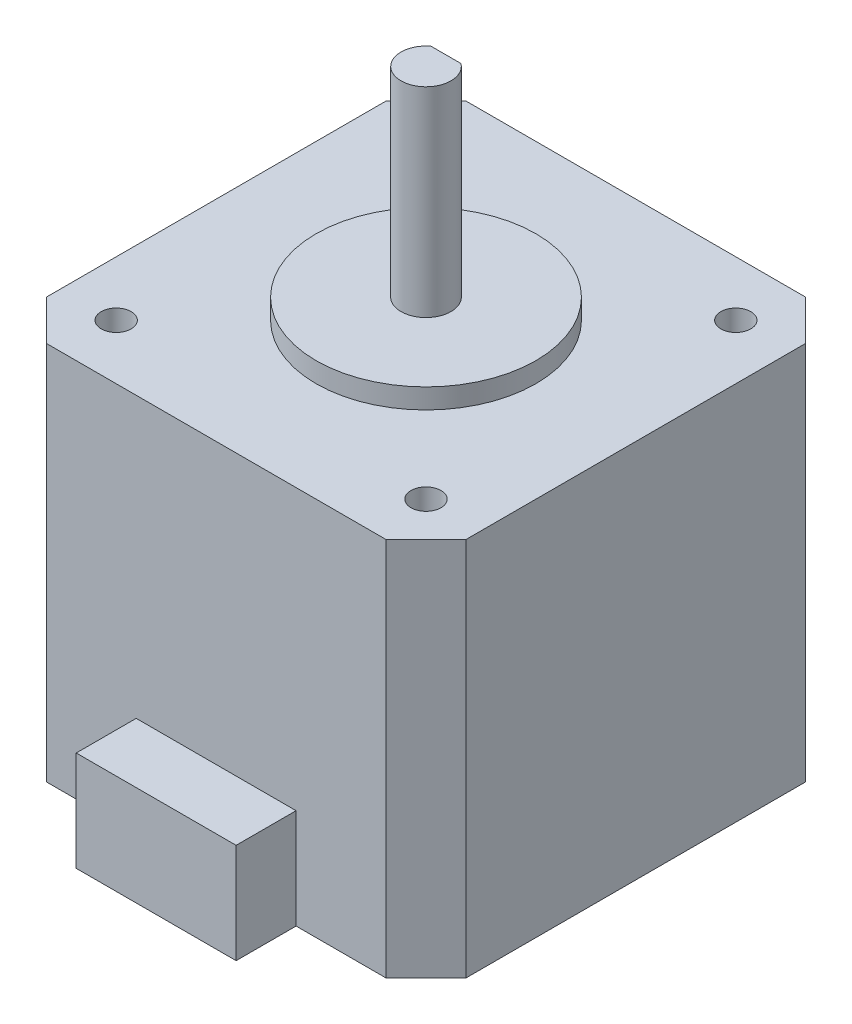
ISO-10303-21;
HEADER;
FILE_DESCRIPTION(('STEP AP214'),'2;1');
FILE_NAME('part.step','',(''),(''),'','','');
FILE_SCHEMA(('AUTOMOTIVE_DESIGN { 1 0 10303 214 1 1 1 1 }'));
ENDSEC;
DATA;
#1=APPLICATION_CONTEXT('core data for automotive mechanical design processes');
#2=APPLICATION_PROTOCOL_DEFINITION('international standard','automotive_design',2000,#1);
#3=PRODUCT_CONTEXT('',#1,'mechanical');
#4=PRODUCT('Part','Part','',(#3));
#5=PRODUCT_RELATED_PRODUCT_CATEGORY('part','',(#4));
#6=PRODUCT_DEFINITION_FORMATION('','',#4);
#7=PRODUCT_DEFINITION_CONTEXT('part definition',#1,'design');
#8=PRODUCT_DEFINITION('design','',#6,#7);
#9=PRODUCT_DEFINITION_SHAPE('','',#8);
#10=(LENGTH_UNIT() NAMED_UNIT(*) SI_UNIT(.MILLI.,.METRE.));
#11=(NAMED_UNIT(*) PLANE_ANGLE_UNIT() SI_UNIT($,.RADIAN.));
#12=(NAMED_UNIT(*) SI_UNIT($,.STERADIAN.) SOLID_ANGLE_UNIT());
#13=UNCERTAINTY_MEASURE_WITH_UNIT(LENGTH_MEASURE(1.E-05),#10,'distance_accuracy_value','');
#14=(GEOMETRIC_REPRESENTATION_CONTEXT(3) GLOBAL_UNCERTAINTY_ASSIGNED_CONTEXT((#13)) GLOBAL_UNIT_ASSIGNED_CONTEXT((#10,
#11,#12)) REPRESENTATION_CONTEXT('',''));
#15=CARTESIAN_POINT('',(0.,0.,0.));
#16=DIRECTION('',(0.,0.,1.));
#17=DIRECTION('',(1.,0.,0.));
#18=AXIS2_PLACEMENT_3D('',#15,#16,#17);
#19=CARTESIAN_POINT('',(-21.,38.,21.));
#20=DIRECTION('',(0.,0.,-1.));
#21=DIRECTION('',(-1.,0.,0.));
#22=AXIS2_PLACEMENT_3D('',#19,#20,#21);
#23=PLANE('',#22);
#24=DIRECTION('',(1.,0.,0.));
#25=VECTOR('',#24,1.);
#26=CARTESIAN_POINT('',(-21.,38.,21.));
#27=LINE('',#26,#25);
#28=CARTESIAN_POINT('',(-17.,38.,21.));
#29=VERTEX_POINT('',#28);
#30=CARTESIAN_POINT('',(17.,38.,21.));
#31=VERTEX_POINT('',#30);
#32=EDGE_CURVE('E221',#29,#31,#27,.T.);
#33=ORIENTED_EDGE('',*,*,#32,.F.);
#34=DIRECTION('',(0.,-1.,0.));
#35=VECTOR('',#34,1.);
#36=CARTESIAN_POINT('',(-17.,38.,21.));
#37=LINE('',#36,#35);
#38=CARTESIAN_POINT('',(-17.,0.,21.));
#39=VERTEX_POINT('',#38);
#40=EDGE_CURVE('E241',#29,#39,#37,.T.);
#41=ORIENTED_EDGE('',*,*,#40,.T.);
#42=DIRECTION('',(1.,0.,0.));
#43=VECTOR('',#42,1.);
#44=CARTESIAN_POINT('',(-21.,0.,21.));
#45=LINE('',#44,#43);
#46=CARTESIAN_POINT('',(-8.,0.,21.));
#47=VERTEX_POINT('',#46);
#48=EDGE_CURVE('E162',#39,#47,#45,.T.);
#49=ORIENTED_EDGE('',*,*,#48,.T.);
#50=DIRECTION('',(0.,-1.,0.));
#51=VECTOR('',#50,1.);
#52=CARTESIAN_POINT('',(-8.,10.,21.));
#53=LINE('',#52,#51);
#54=CARTESIAN_POINT('',(-8.,10.,21.));
#55=VERTEX_POINT('',#54);
#56=EDGE_CURVE('E154',#55,#47,#53,.T.);
#57=ORIENTED_EDGE('',*,*,#56,.F.);
#58=DIRECTION('',(1.,0.,0.));
#59=VECTOR('',#58,1.);
#60=CARTESIAN_POINT('',(-8.,10.,21.));
#61=LINE('',#60,#59);
#62=CARTESIAN_POINT('',(8.,10.,21.));
#63=VERTEX_POINT('',#62);
#64=EDGE_CURVE('E138',#55,#63,#61,.T.);
#65=ORIENTED_EDGE('',*,*,#64,.T.);
#66=DIRECTION('',(0.,-1.,0.));
#67=VECTOR('',#66,1.);
#68=CARTESIAN_POINT('',(8.,10.,21.));
#69=LINE('',#68,#67);
#70=CARTESIAN_POINT('',(7.99999999999999,0.,21.));
#71=VERTEX_POINT('',#70);
#72=EDGE_CURVE('E163',#63,#71,#69,.T.);
#73=ORIENTED_EDGE('',*,*,#72,.T.);
#74=CARTESIAN_POINT('',(17.,0.,21.));
#75=VERTEX_POINT('',#74);
#76=EDGE_CURVE('E238',#71,#75,#45,.T.);
#77=ORIENTED_EDGE('',*,*,#76,.T.);
#78=DIRECTION('',(0.,1.,0.));
#79=VECTOR('',#78,1.);
#80=CARTESIAN_POINT('',(17.,38.,21.));
#81=LINE('',#80,#79);
#82=EDGE_CURVE('E214',#75,#31,#81,.T.);
#83=ORIENTED_EDGE('',*,*,#82,.T.);
#84=EDGE_LOOP('',(#33,#41,#49,#57,#65,#73,#77,#83));
#85=FACE_BOUND('',#84,.T.);
#86=ADVANCED_FACE('F34',(#85),#23,.F.);
#87=CARTESIAN_POINT('',(21.,38.,21.));
#88=DIRECTION('',(-1.,0.,0.));
#89=DIRECTION('',(0.,0.,1.));
#90=AXIS2_PLACEMENT_3D('',#87,#88,#89);
#91=PLANE('',#90);
#92=DIRECTION('',(0.,0.,-1.));
#93=VECTOR('',#92,1.);
#94=CARTESIAN_POINT('',(21.,0.,21.));
#95=LINE('',#94,#93);
#96=CARTESIAN_POINT('',(21.,0.,17.));
#97=VERTEX_POINT('',#96);
#98=CARTESIAN_POINT('',(21.,0.,-17.));
#99=VERTEX_POINT('',#98);
#100=EDGE_CURVE('E218',#97,#99,#95,.T.);
#101=ORIENTED_EDGE('',*,*,#100,.T.);
#102=DIRECTION('',(0.,1.,0.));
#103=VECTOR('',#102,1.);
#104=CARTESIAN_POINT('',(21.,38.,-17.));
#105=LINE('',#104,#103);
#106=CARTESIAN_POINT('',(21.,38.,-17.));
#107=VERTEX_POINT('',#106);
#108=EDGE_CURVE('E11',#99,#107,#105,.T.);
#109=ORIENTED_EDGE('',*,*,#108,.T.);
#110=DIRECTION('',(0.,0.,-1.));
#111=VECTOR('',#110,1.);
#112=CARTESIAN_POINT('',(21.,38.,21.));
#113=LINE('',#112,#111);
#114=CARTESIAN_POINT('',(21.,38.,17.));
#115=VERTEX_POINT('',#114);
#116=EDGE_CURVE('E222',#115,#107,#113,.T.);
#117=ORIENTED_EDGE('',*,*,#116,.F.);
#118=DIRECTION('',(0.,-1.,0.));
#119=VECTOR('',#118,1.);
#120=CARTESIAN_POINT('',(21.,38.,17.));
#121=LINE('',#120,#119);
#122=EDGE_CURVE('E43',#115,#97,#121,.T.);
#123=ORIENTED_EDGE('',*,*,#122,.T.);
#124=EDGE_LOOP('',(#101,#109,#117,#123));
#125=FACE_BOUND('',#124,.T.);
#126=ADVANCED_FACE('F271',(#125),#91,.F.);
#127=CARTESIAN_POINT('',(-21.,38.,-21.));
#128=DIRECTION('',(0.,0.,1.));
#129=DIRECTION('',(1.,0.,0.));
#130=AXIS2_PLACEMENT_3D('',#127,#128,#129);
#131=PLANE('',#130);
#132=DIRECTION('',(-1.,0.,0.));
#133=VECTOR('',#132,1.);
#134=CARTESIAN_POINT('',(-21.,0.,-21.));
#135=LINE('',#134,#133);
#136=CARTESIAN_POINT('',(17.,0.,-21.));
#137=VERTEX_POINT('',#136);
#138=CARTESIAN_POINT('',(-17.,0.,-21.));
#139=VERTEX_POINT('',#138);
#140=EDGE_CURVE('E233',#137,#139,#135,.T.);
#141=ORIENTED_EDGE('',*,*,#140,.T.);
#142=DIRECTION('',(0.,1.,0.));
#143=VECTOR('',#142,1.);
#144=CARTESIAN_POINT('',(-17.,38.,-21.));
#145=LINE('',#144,#143);
#146=CARTESIAN_POINT('',(-17.,38.,-21.));
#147=VERTEX_POINT('',#146);
#148=EDGE_CURVE('E50',#139,#147,#145,.T.);
#149=ORIENTED_EDGE('',*,*,#148,.T.);
#150=DIRECTION('',(-1.,0.,0.));
#151=VECTOR('',#150,1.);
#152=CARTESIAN_POINT('',(-21.,38.,-21.));
#153=LINE('',#152,#151);
#154=CARTESIAN_POINT('',(17.,38.,-21.));
#155=VERTEX_POINT('',#154);
#156=EDGE_CURVE('E224',#155,#147,#153,.T.);
#157=ORIENTED_EDGE('',*,*,#156,.F.);
#158=DIRECTION('',(0.,-1.,0.));
#159=VECTOR('',#158,1.);
#160=CARTESIAN_POINT('',(17.,38.,-21.));
#161=LINE('',#160,#159);
#162=EDGE_CURVE('E263',#155,#137,#161,.T.);
#163=ORIENTED_EDGE('',*,*,#162,.T.);
#164=EDGE_LOOP('',(#141,#149,#157,#163));
#165=FACE_BOUND('',#164,.T.);
#166=ADVANCED_FACE('F283',(#165),#131,.F.);
#167=CARTESIAN_POINT('',(-21.,38.,21.));
#168=DIRECTION('',(1.,0.,0.));
#169=DIRECTION('',(0.,0.,-1.));
#170=AXIS2_PLACEMENT_3D('',#167,#168,#169);
#171=PLANE('',#170);
#172=DIRECTION('',(0.,0.,1.));
#173=VECTOR('',#172,1.);
#174=CARTESIAN_POINT('',(-21.,0.,21.));
#175=LINE('',#174,#173);
#176=CARTESIAN_POINT('',(-21.,0.,-17.));
#177=VERTEX_POINT('',#176);
#178=CARTESIAN_POINT('',(-21.,0.,17.));
#179=VERTEX_POINT('',#178);
#180=EDGE_CURVE('E235',#177,#179,#175,.T.);
#181=ORIENTED_EDGE('',*,*,#180,.T.);
#182=DIRECTION('',(0.,1.,0.));
#183=VECTOR('',#182,1.);
#184=CARTESIAN_POINT('',(-21.,38.,17.));
#185=LINE('',#184,#183);
#186=CARTESIAN_POINT('',(-21.,38.,17.));
#187=VERTEX_POINT('',#186);
#188=EDGE_CURVE('E254',#179,#187,#185,.T.);
#189=ORIENTED_EDGE('',*,*,#188,.T.);
#190=DIRECTION('',(0.,0.,1.));
#191=VECTOR('',#190,1.);
#192=CARTESIAN_POINT('',(-21.,38.,21.));
#193=LINE('',#192,#191);
#194=CARTESIAN_POINT('',(-21.,38.,-17.));
#195=VERTEX_POINT('',#194);
#196=EDGE_CURVE('E226',#195,#187,#193,.T.);
#197=ORIENTED_EDGE('',*,*,#196,.F.);
#198=DIRECTION('',(0.,-1.,0.));
#199=VECTOR('',#198,1.);
#200=CARTESIAN_POINT('',(-21.,38.,-17.));
#201=LINE('',#200,#199);
#202=EDGE_CURVE('E251',#195,#177,#201,.T.);
#203=ORIENTED_EDGE('',*,*,#202,.T.);
#204=EDGE_LOOP('',(#181,#189,#197,#203));
#205=FACE_BOUND('',#204,.T.);
#206=ADVANCED_FACE('F292',(#205),#171,.F.);
#207=CARTESIAN_POINT('',(0.,38.,0.));
#208=DIRECTION('',(0.,-1.,0.));
#209=DIRECTION('',(0.,0.,-1.));
#210=AXIS2_PLACEMENT_3D('',#207,#208,#209);
#211=PLANE('',#210);
#212=CARTESIAN_POINT('',(15.5,38.,15.5000000000001));
#213=DIRECTION('',(0.,1.,0.));
#214=DIRECTION('',(-1.,0.,0.));
#215=AXIS2_PLACEMENT_3D('',#212,#213,#214);
#216=CIRCLE('',#215,1.5);
#217=CARTESIAN_POINT('',(14.,38.,15.5));
#218=VERTEX_POINT('',#217);
#219=EDGE_CURVE('E175',#218,#218,#216,.T.);
#220=ORIENTED_EDGE('',*,*,#219,.F.);
#221=EDGE_LOOP('',(#220));
#222=FACE_BOUND('',#221,.T.);
#223=CARTESIAN_POINT('',(-15.5,38.,15.5000000000001));
#224=DIRECTION('',(0.,1.,0.));
#225=DIRECTION('',(0.,0.,-1.));
#226=AXIS2_PLACEMENT_3D('',#223,#224,#225);
#227=CIRCLE('',#226,1.5);
#228=CARTESIAN_POINT('',(-15.5,38.,14.0000000000001));
#229=VERTEX_POINT('',#228);
#230=EDGE_CURVE('E181',#229,#229,#227,.T.);
#231=ORIENTED_EDGE('',*,*,#230,.F.);
#232=EDGE_LOOP('',(#231));
#233=FACE_BOUND('',#232,.T.);
#234=CARTESIAN_POINT('',(-15.4999999999999,38.,-15.5000000000002));
#235=DIRECTION('',(0.,1.,0.));
#236=DIRECTION('',(1.,0.,0.));
#237=AXIS2_PLACEMENT_3D('',#234,#235,#236);
#238=CIRCLE('',#237,1.5);
#239=CARTESIAN_POINT('',(-13.9999999999999,38.,-15.5000000000001));
#240=VERTEX_POINT('',#239);
#241=EDGE_CURVE('E187',#240,#240,#238,.T.);
#242=ORIENTED_EDGE('',*,*,#241,.F.);
#243=EDGE_LOOP('',(#242));
#244=FACE_BOUND('',#243,.T.);
#245=CARTESIAN_POINT('',(15.5,38.,-15.5000000000001));
#246=DIRECTION('',(0.,1.,0.));
#247=DIRECTION('',(0.,0.,1.));
#248=AXIS2_PLACEMENT_3D('',#245,#246,#247);
#249=CIRCLE('',#248,1.5);
#250=CARTESIAN_POINT('',(15.5,38.,-14.0000000000001));
#251=VERTEX_POINT('',#250);
#252=EDGE_CURVE('E174',#251,#251,#249,.T.);
#253=ORIENTED_EDGE('',*,*,#252,.F.);
#254=EDGE_LOOP('',(#253));
#255=FACE_BOUND('',#254,.T.);
#256=CARTESIAN_POINT('',(0.,38.,0.));
#257=DIRECTION('',(0.,1.,0.));
#258=DIRECTION('',(0.,0.,1.));
#259=AXIS2_PLACEMENT_3D('',#256,#257,#258);
#260=CIRCLE('',#259,11.);
#261=CARTESIAN_POINT('',(0.,38.,11.));
#262=VERTEX_POINT('',#261);
#263=EDGE_CURVE('E215',#262,#262,#260,.T.);
#264=ORIENTED_EDGE('',*,*,#263,.F.);
#265=EDGE_LOOP('',(#264));
#266=FACE_BOUND('',#265,.T.);
#267=ORIENTED_EDGE('',*,*,#196,.T.);
#268=DIRECTION('',(-0.707106781186547,0.,-0.707106781186548));
#269=VECTOR('',#268,1.);
#270=CARTESIAN_POINT('',(-17.,38.,21.));
#271=LINE('',#270,#269);
#272=EDGE_CURVE('E261',#187,#29,#271,.F.);
#273=ORIENTED_EDGE('',*,*,#272,.T.);
#274=ORIENTED_EDGE('',*,*,#32,.T.);
#275=DIRECTION('',(-0.707106781186548,0.,0.707106781186547));
#276=VECTOR('',#275,1.);
#277=CARTESIAN_POINT('',(21.,38.,17.));
#278=LINE('',#277,#276);
#279=EDGE_CURVE('E256',#31,#115,#278,.F.);
#280=ORIENTED_EDGE('',*,*,#279,.T.);
#281=ORIENTED_EDGE('',*,*,#116,.T.);
#282=DIRECTION('',(0.707106781186547,0.,0.707106781186548));
#283=VECTOR('',#282,1.);
#284=CARTESIAN_POINT('',(17.,38.,-21.));
#285=LINE('',#284,#283);
#286=EDGE_CURVE('E57',#107,#155,#285,.F.);
#287=ORIENTED_EDGE('',*,*,#286,.T.);
#288=ORIENTED_EDGE('',*,*,#156,.T.);
#289=DIRECTION('',(0.707106781186548,0.,-0.707106781186547));
#290=VECTOR('',#289,1.);
#291=CARTESIAN_POINT('',(-21.,38.,-17.));
#292=LINE('',#291,#290);
#293=EDGE_CURVE('E259',#147,#195,#292,.F.);
#294=ORIENTED_EDGE('',*,*,#293,.T.);
#295=EDGE_LOOP('',(#267,#273,#274,#280,#281,#287,#288,#294));
#296=FACE_BOUND('',#295,.T.);
#297=ADVANCED_FACE('F285',(#222,#233,#244,#255,#266,#296),#211,.F.);
#298=CARTESIAN_POINT('',(0.,0.,0.));
#299=DIRECTION('',(0.,-1.,0.));
#300=DIRECTION('',(0.,0.,-1.));
#301=AXIS2_PLACEMENT_3D('',#298,#299,#300);
#302=PLANE('',#301);
#303=ORIENTED_EDGE('',*,*,#48,.F.);
#304=DIRECTION('',(0.707106781186547,0.,0.707106781186548));
#305=VECTOR('',#304,1.);
#306=CARTESIAN_POINT('',(-19.,0.,19.));
#307=LINE('',#306,#305);
#308=EDGE_CURVE('E249',#39,#179,#307,.F.);
#309=ORIENTED_EDGE('',*,*,#308,.T.);
#310=ORIENTED_EDGE('',*,*,#180,.F.);
#311=DIRECTION('',(-0.707106781186548,0.,0.707106781186547));
#312=VECTOR('',#311,1.);
#313=CARTESIAN_POINT('',(-19.,0.,-19.));
#314=LINE('',#313,#312);
#315=EDGE_CURVE('E247',#177,#139,#314,.F.);
#316=ORIENTED_EDGE('',*,*,#315,.T.);
#317=ORIENTED_EDGE('',*,*,#140,.F.);
#318=DIRECTION('',(-0.707106781186547,0.,-0.707106781186548));
#319=VECTOR('',#318,1.);
#320=CARTESIAN_POINT('',(19.,0.,-19.));
#321=LINE('',#320,#319);
#322=EDGE_CURVE('E245',#137,#99,#321,.F.);
#323=ORIENTED_EDGE('',*,*,#322,.T.);
#324=ORIENTED_EDGE('',*,*,#100,.F.);
#325=DIRECTION('',(0.707106781186548,0.,-0.707106781186547));
#326=VECTOR('',#325,1.);
#327=CARTESIAN_POINT('',(19.,0.,19.));
#328=LINE('',#327,#326);
#329=EDGE_CURVE('E243',#97,#75,#328,.F.);
#330=ORIENTED_EDGE('',*,*,#329,.T.);
#331=ORIENTED_EDGE('',*,*,#76,.F.);
#332=DIRECTION('',(0.,0.,1.));
#333=VECTOR('',#332,1.);
#334=CARTESIAN_POINT('',(8.,0.,21.));
#335=LINE('',#334,#333);
#336=CARTESIAN_POINT('',(8.,0.,27.));
#337=VERTEX_POINT('',#336);
#338=EDGE_CURVE('E598',#71,#337,#335,.T.);
#339=ORIENTED_EDGE('',*,*,#338,.T.);
#340=DIRECTION('',(-1.,0.,0.));
#341=VECTOR('',#340,1.);
#342=CARTESIAN_POINT('',(-8.,0.,27.));
#343=LINE('',#342,#341);
#344=CARTESIAN_POINT('',(-8.,0.,27.));
#345=VERTEX_POINT('',#344);
#346=EDGE_CURVE('E157',#337,#345,#343,.T.);
#347=ORIENTED_EDGE('',*,*,#346,.T.);
#348=DIRECTION('',(0.,0.,-1.));
#349=VECTOR('',#348,1.);
#350=CARTESIAN_POINT('',(-8.,0.,21.));
#351=LINE('',#350,#349);
#352=EDGE_CURVE('E600',#345,#47,#351,.T.);
#353=ORIENTED_EDGE('',*,*,#352,.T.);
#354=EDGE_LOOP('',(#303,#309,#310,#316,#317,#323,#324,#330,#331,#339,#347,#353));
#355=FACE_BOUND('',#354,.T.);
#356=ADVANCED_FACE('F276',(#355),#302,.T.);
#357=CARTESIAN_POINT('',(0.,40.,0.));
#358=DIRECTION('',(0.,-1.,0.));
#359=DIRECTION('',(0.,0.,-1.));
#360=AXIS2_PLACEMENT_3D('',#357,#358,#359);
#361=CYLINDRICAL_SURFACE('',#360,11.);
#362=CARTESIAN_POINT('',(0.,40.,0.));
#363=DIRECTION('',(0.,1.,0.));
#364=DIRECTION('',(0.,0.,1.));
#365=AXIS2_PLACEMENT_3D('',#362,#363,#364);
#366=CIRCLE('',#365,11.);
#367=CARTESIAN_POINT('',(0.,40.,11.));
#368=VERTEX_POINT('',#367);
#369=EDGE_CURVE('E210',#368,#368,#366,.T.);
#370=ORIENTED_EDGE('',*,*,#369,.F.);
#371=EDGE_LOOP('',(#370));
#372=FACE_BOUND('',#371,.T.);
#373=ORIENTED_EDGE('',*,*,#263,.T.);
#374=EDGE_LOOP('',(#373));
#375=FACE_BOUND('',#374,.T.);
#376=ADVANCED_FACE('F393',(#372,#375),#361,.T.);
#377=CARTESIAN_POINT('',(0.,40.,0.));
#378=DIRECTION('',(0.,1.,0.));
#379=DIRECTION('',(0.,0.,1.));
#380=AXIS2_PLACEMENT_3D('',#377,#378,#379);
#381=PLANE('',#380);
#382=CARTESIAN_POINT('',(0.,40.,0.));
#383=DIRECTION('',(0.,1.,0.));
#384=DIRECTION('',(0.,0.,1.));
#385=AXIS2_PLACEMENT_3D('',#382,#383,#384);
#386=CIRCLE('',#385,2.5);
#387=CARTESIAN_POINT('',(0.,40.,2.5));
#388=VERTEX_POINT('',#387);
#389=EDGE_CURVE('E211',#388,#388,#386,.T.);
#390=ORIENTED_EDGE('',*,*,#389,.F.);
#391=EDGE_LOOP('',(#390));
#392=FACE_BOUND('',#391,.T.);
#393=ORIENTED_EDGE('',*,*,#369,.T.);
#394=EDGE_LOOP('',(#393));
#395=FACE_BOUND('',#394,.T.);
#396=ADVANCED_FACE('F508',(#392,#395),#381,.T.);
#397=CARTESIAN_POINT('',(0.,60.,0.));
#398=DIRECTION('',(0.,-1.,0.));
#399=DIRECTION('',(0.,0.,-1.));
#400=AXIS2_PLACEMENT_3D('',#397,#398,#399);
#401=CYLINDRICAL_SURFACE('',#400,2.5);
#402=CARTESIAN_POINT('',(0.,60.,0.));
#403=DIRECTION('',(0.,1.,0.));
#404=DIRECTION('',(0.,0.,1.));
#405=AXIS2_PLACEMENT_3D('',#402,#403,#404);
#406=CIRCLE('',#405,2.5);
#407=CARTESIAN_POINT('',(-1.5,60.,-2.));
#408=VERTEX_POINT('',#407);
#409=CARTESIAN_POINT('',(1.5,60.,-2.));
#410=VERTEX_POINT('',#409);
#411=EDGE_CURVE('E206',#408,#410,#406,.T.);
#412=ORIENTED_EDGE('',*,*,#411,.F.);
#413=DIRECTION('',(0.,1.,0.));
#414=VECTOR('',#413,1.);
#415=CARTESIAN_POINT('',(-1.5,45.,-2.));
#416=LINE('',#415,#414);
#417=CARTESIAN_POINT('',(-1.5,45.,-2.));
#418=VERTEX_POINT('',#417);
#419=EDGE_CURVE('E201',#418,#408,#416,.T.);
#420=ORIENTED_EDGE('',*,*,#419,.F.);
#421=CARTESIAN_POINT('',(0.,45.,0.));
#422=DIRECTION('',(0.,1.,0.));
#423=DIRECTION('',(0.,0.,1.));
#424=AXIS2_PLACEMENT_3D('',#421,#422,#423);
#425=CIRCLE('',#424,2.5);
#426=CARTESIAN_POINT('',(1.5,45.,-2.));
#427=VERTEX_POINT('',#426);
#428=EDGE_CURVE('E196',#427,#418,#425,.T.);
#429=ORIENTED_EDGE('',*,*,#428,.F.);
#430=DIRECTION('',(0.,1.,0.));
#431=VECTOR('',#430,1.);
#432=CARTESIAN_POINT('',(1.5,45.,-2.));
#433=LINE('',#432,#431);
#434=EDGE_CURVE('E203',#427,#410,#433,.T.);
#435=ORIENTED_EDGE('',*,*,#434,.T.);
#436=EDGE_LOOP('',(#412,#420,#429,#435));
#437=FACE_BOUND('',#436,.T.);
#438=ORIENTED_EDGE('',*,*,#389,.T.);
#439=EDGE_LOOP('',(#438));
#440=FACE_BOUND('',#439,.T.);
#441=ADVANCED_FACE('F499',(#437,#440),#401,.T.);
#442=CARTESIAN_POINT('',(0.,60.,0.));
#443=DIRECTION('',(0.,1.,0.));
#444=DIRECTION('',(0.,0.,1.));
#445=AXIS2_PLACEMENT_3D('',#442,#443,#444);
#446=PLANE('',#445);
#447=DIRECTION('',(1.,0.,0.));
#448=VECTOR('',#447,1.);
#449=CARTESIAN_POINT('',(-1.5,60.,-2.));
#450=LINE('',#449,#448);
#451=EDGE_CURVE('E193',#408,#410,#450,.T.);
#452=ORIENTED_EDGE('',*,*,#451,.F.);
#453=ORIENTED_EDGE('',*,*,#411,.T.);
#454=EDGE_LOOP('',(#452,#453));
#455=FACE_BOUND('',#454,.T.);
#456=ADVANCED_FACE('F490',(#455),#446,.T.);
#457=CARTESIAN_POINT('',(-1.5,45.,-2.));
#458=DIRECTION('',(0.,0.,1.));
#459=DIRECTION('',(1.,0.,0.));
#460=AXIS2_PLACEMENT_3D('',#457,#458,#459);
#461=PLANE('',#460);
#462=ORIENTED_EDGE('',*,*,#451,.T.);
#463=ORIENTED_EDGE('',*,*,#434,.F.);
#464=DIRECTION('',(1.,0.,0.));
#465=VECTOR('',#464,1.);
#466=CARTESIAN_POINT('',(-1.5,45.,-2.));
#467=LINE('',#466,#465);
#468=EDGE_CURVE('E198',#418,#427,#467,.T.);
#469=ORIENTED_EDGE('',*,*,#468,.F.);
#470=ORIENTED_EDGE('',*,*,#419,.T.);
#471=EDGE_LOOP('',(#462,#463,#469,#470));
#472=FACE_BOUND('',#471,.T.);
#473=ADVANCED_FACE('F481',(#472),#461,.F.);
#474=CARTESIAN_POINT('',(0.,45.,0.));
#475=DIRECTION('',(0.,1.,0.));
#476=DIRECTION('',(0.,0.,1.));
#477=AXIS2_PLACEMENT_3D('',#474,#475,#476);
#478=PLANE('',#477);
#479=ORIENTED_EDGE('',*,*,#428,.T.);
#480=ORIENTED_EDGE('',*,*,#468,.T.);
#481=EDGE_LOOP('',(#479,#480));
#482=FACE_BOUND('',#481,.T.);
#483=ADVANCED_FACE('F472',(#482),#478,.T.);
#484=CARTESIAN_POINT('',(15.5,33.5,-15.5000000000001));
#485=DIRECTION('',(0.,1.,0.));
#486=DIRECTION('',(0.,0.,1.));
#487=AXIS2_PLACEMENT_3D('',#484,#485,#486);
#488=CYLINDRICAL_SURFACE('',#487,1.5);
#489=CARTESIAN_POINT('',(15.5,33.5,-15.5000000000001));
#490=DIRECTION('',(0.,1.,0.));
#491=DIRECTION('',(0.,0.,1.));
#492=AXIS2_PLACEMENT_3D('',#489,#490,#491);
#493=CIRCLE('',#492,1.5);
#494=CARTESIAN_POINT('',(15.5,33.5,-14.0000000000001));
#495=VERTEX_POINT('',#494);
#496=EDGE_CURVE('E190',#495,#495,#493,.T.);
#497=ORIENTED_EDGE('',*,*,#496,.F.);
#498=EDGE_LOOP('',(#497));
#499=FACE_BOUND('',#498,.T.);
#500=ORIENTED_EDGE('',*,*,#252,.T.);
#501=EDGE_LOOP('',(#500));
#502=FACE_BOUND('',#501,.T.);
#503=ADVANCED_FACE('F463',(#499,#502),#488,.F.);
#504=CARTESIAN_POINT('',(15.5,33.5,-15.5000000000001));
#505=DIRECTION('',(0.,1.,0.));
#506=DIRECTION('',(0.,0.,1.));
#507=AXIS2_PLACEMENT_3D('',#504,#505,#506);
#508=PLANE('',#507);
#509=ORIENTED_EDGE('',*,*,#496,.T.);
#510=EDGE_LOOP('',(#509));
#511=FACE_BOUND('',#510,.T.);
#512=ADVANCED_FACE('F454',(#511),#508,.T.);
#513=CARTESIAN_POINT('',(-15.4999999999999,33.5,-15.5000000000002));
#514=DIRECTION('',(0.,1.,0.));
#515=DIRECTION('',(0.,0.,1.));
#516=AXIS2_PLACEMENT_3D('',#513,#514,#515);
#517=CYLINDRICAL_SURFACE('',#516,1.5);
#518=CARTESIAN_POINT('',(-15.4999999999999,33.5,-15.5000000000002));
#519=DIRECTION('',(0.,1.,0.));
#520=DIRECTION('',(1.,0.,0.));
#521=AXIS2_PLACEMENT_3D('',#518,#519,#520);
#522=CIRCLE('',#521,1.5);
#523=CARTESIAN_POINT('',(-13.9999999999999,33.5,-15.5000000000001));
#524=VERTEX_POINT('',#523);
#525=EDGE_CURVE('E184',#524,#524,#522,.T.);
#526=ORIENTED_EDGE('',*,*,#525,.F.);
#527=EDGE_LOOP('',(#526));
#528=FACE_BOUND('',#527,.T.);
#529=ORIENTED_EDGE('',*,*,#241,.T.);
#530=EDGE_LOOP('',(#529));
#531=FACE_BOUND('',#530,.T.);
#532=ADVANCED_FACE('F445',(#528,#531),#517,.F.);
#533=CARTESIAN_POINT('',(-15.4999999999999,33.5,-15.5000000000002));
#534=DIRECTION('',(0.,1.,0.));
#535=DIRECTION('',(1.,0.,0.));
#536=AXIS2_PLACEMENT_3D('',#533,#534,#535);
#537=PLANE('',#536);
#538=ORIENTED_EDGE('',*,*,#525,.T.);
#539=EDGE_LOOP('',(#538));
#540=FACE_BOUND('',#539,.T.);
#541=ADVANCED_FACE('F436',(#540),#537,.T.);
#542=CARTESIAN_POINT('',(-15.5,33.5,15.5000000000001));
#543=DIRECTION('',(0.,1.,0.));
#544=DIRECTION('',(0.,0.,1.));
#545=AXIS2_PLACEMENT_3D('',#542,#543,#544);
#546=CYLINDRICAL_SURFACE('',#545,1.5);
#547=CARTESIAN_POINT('',(-15.5,33.5,15.5000000000001));
#548=DIRECTION('',(0.,1.,0.));
#549=DIRECTION('',(0.,0.,-1.));
#550=AXIS2_PLACEMENT_3D('',#547,#548,#549);
#551=CIRCLE('',#550,1.5);
#552=CARTESIAN_POINT('',(-15.5,33.5,14.0000000000001));
#553=VERTEX_POINT('',#552);
#554=EDGE_CURVE('E178',#553,#553,#551,.T.);
#555=ORIENTED_EDGE('',*,*,#554,.F.);
#556=EDGE_LOOP('',(#555));
#557=FACE_BOUND('',#556,.T.);
#558=ORIENTED_EDGE('',*,*,#230,.T.);
#559=EDGE_LOOP('',(#558));
#560=FACE_BOUND('',#559,.T.);
#561=ADVANCED_FACE('F427',(#557,#560),#546,.F.);
#562=CARTESIAN_POINT('',(-15.5,33.5,15.5000000000001));
#563=DIRECTION('',(0.,1.,0.));
#564=DIRECTION('',(0.,0.,-1.));
#565=AXIS2_PLACEMENT_3D('',#562,#563,#564);
#566=PLANE('',#565);
#567=ORIENTED_EDGE('',*,*,#554,.T.);
#568=EDGE_LOOP('',(#567));
#569=FACE_BOUND('',#568,.T.);
#570=ADVANCED_FACE('F418',(#569),#566,.T.);
#571=CARTESIAN_POINT('',(15.5,33.5,15.5000000000001));
#572=DIRECTION('',(0.,1.,0.));
#573=DIRECTION('',(0.,0.,1.));
#574=AXIS2_PLACEMENT_3D('',#571,#572,#573);
#575=CYLINDRICAL_SURFACE('',#574,1.5);
#576=CARTESIAN_POINT('',(15.5,33.5,15.5000000000001));
#577=DIRECTION('',(0.,1.,0.));
#578=DIRECTION('',(-1.,0.,0.));
#579=AXIS2_PLACEMENT_3D('',#576,#577,#578);
#580=CIRCLE('',#579,1.5);
#581=CARTESIAN_POINT('',(14.,33.5,15.5));
#582=VERTEX_POINT('',#581);
#583=EDGE_CURVE('E171',#582,#582,#580,.T.);
#584=ORIENTED_EDGE('',*,*,#583,.F.);
#585=EDGE_LOOP('',(#584));
#586=FACE_BOUND('',#585,.T.);
#587=ORIENTED_EDGE('',*,*,#219,.T.);
#588=EDGE_LOOP('',(#587));
#589=FACE_BOUND('',#588,.T.);
#590=ADVANCED_FACE('F409',(#586,#589),#575,.F.);
#591=CARTESIAN_POINT('',(15.5,33.5,15.5000000000001));
#592=DIRECTION('',(0.,1.,0.));
#593=DIRECTION('',(-1.,0.,0.));
#594=AXIS2_PLACEMENT_3D('',#591,#592,#593);
#595=PLANE('',#594);
#596=ORIENTED_EDGE('',*,*,#583,.T.);
#597=EDGE_LOOP('',(#596));
#598=FACE_BOUND('',#597,.T.);
#599=ADVANCED_FACE('F384',(#598),#595,.T.);
#600=CARTESIAN_POINT('',(-8.,10.,21.));
#601=DIRECTION('',(-1.,0.,0.));
#602=DIRECTION('',(0.,0.,1.));
#603=AXIS2_PLACEMENT_3D('',#600,#601,#602);
#604=PLANE('',#603);
#605=ORIENTED_EDGE('',*,*,#352,.F.);
#606=DIRECTION('',(0.,-1.,0.));
#607=VECTOR('',#606,1.);
#608=CARTESIAN_POINT('',(-8.,10.,27.));
#609=LINE('',#608,#607);
#610=CARTESIAN_POINT('',(-8.,10.,27.));
#611=VERTEX_POINT('',#610);
#612=EDGE_CURVE('E156',#611,#345,#609,.T.);
#613=ORIENTED_EDGE('',*,*,#612,.F.);
#614=DIRECTION('',(0.,0.,-1.));
#615=VECTOR('',#614,1.);
#616=CARTESIAN_POINT('',(-8.,10.,21.));
#617=LINE('',#616,#615);
#618=EDGE_CURVE('E142',#611,#55,#617,.T.);
#619=ORIENTED_EDGE('',*,*,#618,.T.);
#620=ORIENTED_EDGE('',*,*,#56,.T.);
#621=EDGE_LOOP('',(#605,#613,#619,#620));
#622=FACE_BOUND('',#621,.T.);
#623=ADVANCED_FACE('F153',(#622),#604,.T.);
#624=CARTESIAN_POINT('',(-8.,10.,27.));
#625=DIRECTION('',(0.,0.,1.));
#626=DIRECTION('',(1.,0.,0.));
#627=AXIS2_PLACEMENT_3D('',#624,#625,#626);
#628=PLANE('',#627);
#629=ORIENTED_EDGE('',*,*,#346,.F.);
#630=DIRECTION('',(0.,-1.,0.));
#631=VECTOR('',#630,1.);
#632=CARTESIAN_POINT('',(8.,10.,27.));
#633=LINE('',#632,#631);
#634=CARTESIAN_POINT('',(8.,10.,27.));
#635=VERTEX_POINT('',#634);
#636=EDGE_CURVE('E166',#635,#337,#633,.T.);
#637=ORIENTED_EDGE('',*,*,#636,.F.);
#638=DIRECTION('',(-1.,0.,0.));
#639=VECTOR('',#638,1.);
#640=CARTESIAN_POINT('',(-8.,10.,27.));
#641=LINE('',#640,#639);
#642=EDGE_CURVE('E164',#635,#611,#641,.T.);
#643=ORIENTED_EDGE('',*,*,#642,.T.);
#644=ORIENTED_EDGE('',*,*,#612,.T.);
#645=EDGE_LOOP('',(#629,#637,#643,#644));
#646=FACE_BOUND('',#645,.T.);
#647=ADVANCED_FACE('F367',(#646),#628,.T.);
#648=CARTESIAN_POINT('',(8.,10.,21.));
#649=DIRECTION('',(1.,0.,0.));
#650=DIRECTION('',(0.,0.,-1.));
#651=AXIS2_PLACEMENT_3D('',#648,#649,#650);
#652=PLANE('',#651);
#653=ORIENTED_EDGE('',*,*,#338,.F.);
#654=ORIENTED_EDGE('',*,*,#72,.F.);
#655=DIRECTION('',(0.,0.,1.));
#656=VECTOR('',#655,1.);
#657=CARTESIAN_POINT('',(8.,10.,21.));
#658=LINE('',#657,#656);
#659=EDGE_CURVE('E145',#63,#635,#658,.T.);
#660=ORIENTED_EDGE('',*,*,#659,.T.);
#661=ORIENTED_EDGE('',*,*,#636,.T.);
#662=EDGE_LOOP('',(#653,#654,#660,#661));
#663=FACE_BOUND('',#662,.T.);
#664=ADVANCED_FACE('F359',(#663),#652,.T.);
#665=CARTESIAN_POINT('',(0.,10.,0.));
#666=DIRECTION('',(0.,1.,0.));
#667=DIRECTION('',(0.,0.,1.));
#668=AXIS2_PLACEMENT_3D('',#665,#666,#667);
#669=PLANE('',#668);
#670=ORIENTED_EDGE('',*,*,#618,.F.);
#671=ORIENTED_EDGE('',*,*,#642,.F.);
#672=ORIENTED_EDGE('',*,*,#659,.F.);
#673=ORIENTED_EDGE('',*,*,#64,.F.);
#674=EDGE_LOOP('',(#670,#671,#672,#673));
#675=FACE_BOUND('',#674,.T.);
#676=ADVANCED_FACE('F140',(#675),#669,.T.);
#677=CARTESIAN_POINT('',(-17.,38.,21.));
#678=DIRECTION('',(0.707106781186548,0.,-0.707106781186547));
#679=DIRECTION('',(0.,-1.,0.));
#680=AXIS2_PLACEMENT_3D('',#677,#678,#679);
#681=PLANE('',#680);
#682=ORIENTED_EDGE('',*,*,#272,.F.);
#683=ORIENTED_EDGE('',*,*,#188,.F.);
#684=ORIENTED_EDGE('',*,*,#308,.F.);
#685=ORIENTED_EDGE('',*,*,#40,.F.);
#686=EDGE_LOOP('',(#682,#683,#684,#685));
#687=FACE_BOUND('',#686,.T.);
#688=ADVANCED_FACE('F297',(#687),#681,.F.);
#689=CARTESIAN_POINT('',(-21.,38.,-17.));
#690=DIRECTION('',(0.707106781186547,0.,0.707106781186548));
#691=DIRECTION('',(0.,-1.,0.));
#692=AXIS2_PLACEMENT_3D('',#689,#690,#691);
#693=PLANE('',#692);
#694=ORIENTED_EDGE('',*,*,#293,.F.);
#695=ORIENTED_EDGE('',*,*,#148,.F.);
#696=ORIENTED_EDGE('',*,*,#315,.F.);
#697=ORIENTED_EDGE('',*,*,#202,.F.);
#698=EDGE_LOOP('',(#694,#695,#696,#697));
#699=FACE_BOUND('',#698,.T.);
#700=ADVANCED_FACE('F289',(#699),#693,.F.);
#701=CARTESIAN_POINT('',(17.,38.,-21.));
#702=DIRECTION('',(-0.707106781186548,0.,0.707106781186547));
#703=DIRECTION('',(0.,-1.,0.));
#704=AXIS2_PLACEMENT_3D('',#701,#702,#703);
#705=PLANE('',#704);
#706=ORIENTED_EDGE('',*,*,#286,.F.);
#707=ORIENTED_EDGE('',*,*,#108,.F.);
#708=ORIENTED_EDGE('',*,*,#322,.F.);
#709=ORIENTED_EDGE('',*,*,#162,.F.);
#710=EDGE_LOOP('',(#706,#707,#708,#709));
#711=FACE_BOUND('',#710,.T.);
#712=ADVANCED_FACE('F282',(#711),#705,.F.);
#713=CARTESIAN_POINT('',(21.,38.,17.));
#714=DIRECTION('',(-0.707106781186547,0.,-0.707106781186548));
#715=DIRECTION('',(0.,-1.,0.));
#716=AXIS2_PLACEMENT_3D('',#713,#714,#715);
#717=PLANE('',#716);
#718=ORIENTED_EDGE('',*,*,#279,.F.);
#719=ORIENTED_EDGE('',*,*,#82,.F.);
#720=ORIENTED_EDGE('',*,*,#329,.F.);
#721=ORIENTED_EDGE('',*,*,#122,.F.);
#722=EDGE_LOOP('',(#718,#719,#720,#721));
#723=FACE_BOUND('',#722,.T.);
#724=ADVANCED_FACE('F37',(#723),#717,.F.);
#725=CLOSED_SHELL('',(#86,#126,#166,#206,#297,#356,#376,#396,#441,#456,#473,#483,#503,#512,#532,
#541,#561,#570,#590,#599,#623,#647,#664,#676,#688,#700,#712,#724));
#726=MANIFOLD_SOLID_BREP('B2',#725);
#727=ADVANCED_BREP_SHAPE_REPRESENTATION('',(#18,#726),#14);
#728=SHAPE_DEFINITION_REPRESENTATION(#9,#727);
ENDSEC;
END-ISO-10303-21;
